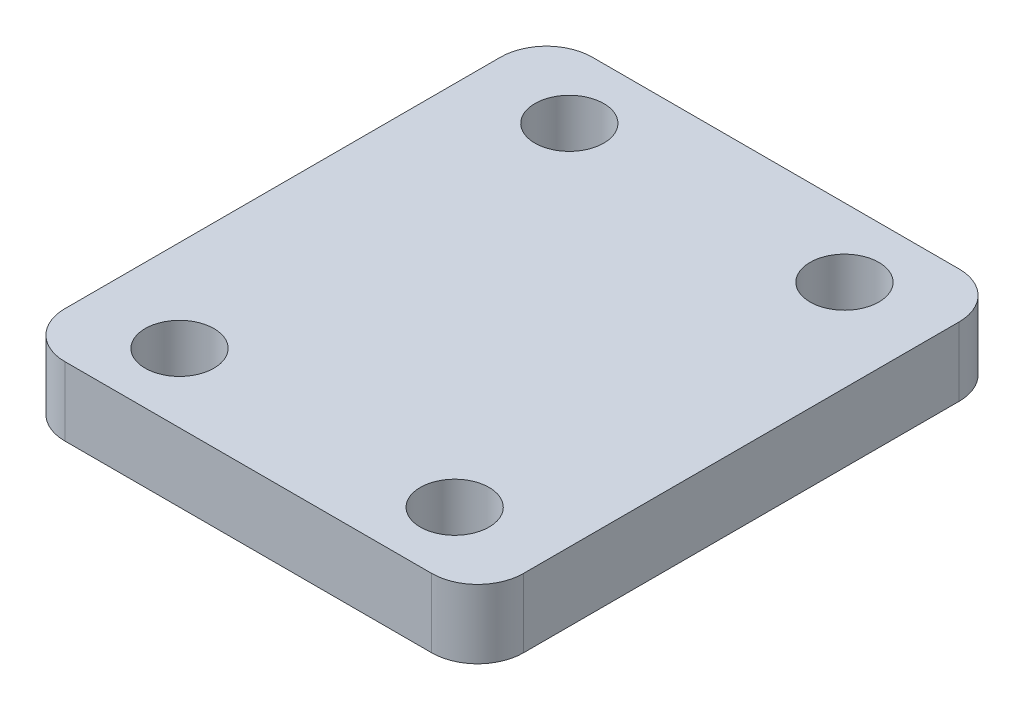
ISO-10303-21;
HEADER;
FILE_DESCRIPTION(('STEP AP214'),'2;1');
FILE_NAME('part.step','',(''),(''),'','','');
FILE_SCHEMA(('AUTOMOTIVE_DESIGN { 1 0 10303 214 1 1 1 1 }'));
ENDSEC;
DATA;
#1=APPLICATION_CONTEXT('core data for automotive mechanical design processes');
#2=APPLICATION_PROTOCOL_DEFINITION('international standard','automotive_design',2000,#1);
#3=PRODUCT_CONTEXT('',#1,'mechanical');
#4=PRODUCT('Part','Part','',(#3));
#5=PRODUCT_RELATED_PRODUCT_CATEGORY('part','',(#4));
#6=PRODUCT_DEFINITION_FORMATION('','',#4);
#7=PRODUCT_DEFINITION_CONTEXT('part definition',#1,'design');
#8=PRODUCT_DEFINITION('design','',#6,#7);
#9=PRODUCT_DEFINITION_SHAPE('','',#8);
#10=(LENGTH_UNIT() NAMED_UNIT(*) SI_UNIT(.MILLI.,.METRE.));
#11=(NAMED_UNIT(*) PLANE_ANGLE_UNIT() SI_UNIT($,.RADIAN.));
#12=(NAMED_UNIT(*) SI_UNIT($,.STERADIAN.) SOLID_ANGLE_UNIT());
#13=UNCERTAINTY_MEASURE_WITH_UNIT(LENGTH_MEASURE(1.E-05),#10,'distance_accuracy_value','');
#14=(GEOMETRIC_REPRESENTATION_CONTEXT(3) GLOBAL_UNCERTAINTY_ASSIGNED_CONTEXT((#13)) GLOBAL_UNIT_ASSIGNED_CONTEXT((#10,
#11,#12)) REPRESENTATION_CONTEXT('',''));
#15=CARTESIAN_POINT('',(0.,0.,0.));
#16=DIRECTION('',(0.,0.,1.));
#17=DIRECTION('',(1.,0.,0.));
#18=AXIS2_PLACEMENT_3D('',#15,#16,#17);
#19=CARTESIAN_POINT('',(0.,3.,0.));
#20=DIRECTION('',(0.,-1.,0.));
#21=DIRECTION('',(0.,0.,-1.));
#22=AXIS2_PLACEMENT_3D('',#19,#20,#21);
#23=PLANE('',#22);
#24=DIRECTION('',(1.,0.,0.));
#25=VECTOR('',#24,1.);
#26=CARTESIAN_POINT('',(-10.,3.,11.5));
#27=LINE('',#26,#25);
#28=CARTESIAN_POINT('',(-8.,3.,11.5));
#29=VERTEX_POINT('',#28);
#30=CARTESIAN_POINT('',(8.,3.,11.5));
#31=VERTEX_POINT('',#30);
#32=EDGE_CURVE('E153',#29,#31,#27,.T.);
#33=ORIENTED_EDGE('',*,*,#32,.T.);
#34=CARTESIAN_POINT('',(8.,3.,9.5));
#35=DIRECTION('',(0.,-1.,0.));
#36=DIRECTION('',(0.,0.,-1.));
#37=AXIS2_PLACEMENT_3D('',#34,#35,#36);
#38=CIRCLE('',#37,2.);
#39=CARTESIAN_POINT('',(10.,3.,9.5));
#40=VERTEX_POINT('',#39);
#41=EDGE_CURVE('E182',#31,#40,#38,.F.);
#42=ORIENTED_EDGE('',*,*,#41,.T.);
#43=DIRECTION('',(0.,0.,-1.));
#44=VECTOR('',#43,1.);
#45=CARTESIAN_POINT('',(10.,3.,11.5));
#46=LINE('',#45,#44);
#47=CARTESIAN_POINT('',(10.,3.,-9.5));
#48=VERTEX_POINT('',#47);
#49=EDGE_CURVE('E131',#40,#48,#46,.T.);
#50=ORIENTED_EDGE('',*,*,#49,.T.);
#51=CARTESIAN_POINT('',(8.,3.,-9.5));
#52=DIRECTION('',(0.,-1.,0.));
#53=DIRECTION('',(0.,0.,-1.));
#54=AXIS2_PLACEMENT_3D('',#51,#52,#53);
#55=CIRCLE('',#54,2.);
#56=CARTESIAN_POINT('',(8.,3.,-11.5));
#57=VERTEX_POINT('',#56);
#58=EDGE_CURVE('E176',#48,#57,#55,.F.);
#59=ORIENTED_EDGE('',*,*,#58,.T.);
#60=DIRECTION('',(-1.,0.,0.));
#61=VECTOR('',#60,1.);
#62=CARTESIAN_POINT('',(-10.,3.,-11.5));
#63=LINE('',#62,#61);
#64=CARTESIAN_POINT('',(-8.,3.,-11.5));
#65=VERTEX_POINT('',#64);
#66=EDGE_CURVE('E195',#57,#65,#63,.T.);
#67=ORIENTED_EDGE('',*,*,#66,.T.);
#68=CARTESIAN_POINT('',(-8.,3.,-9.5));
#69=DIRECTION('',(0.,-1.,0.));
#70=DIRECTION('',(0.,0.,-1.));
#71=AXIS2_PLACEMENT_3D('',#68,#69,#70);
#72=CIRCLE('',#71,2.);
#73=CARTESIAN_POINT('',(-10.,3.,-9.5));
#74=VERTEX_POINT('',#73);
#75=EDGE_CURVE('E65',#65,#74,#72,.F.);
#76=ORIENTED_EDGE('',*,*,#75,.T.);
#77=DIRECTION('',(0.,0.,1.));
#78=VECTOR('',#77,1.);
#79=CARTESIAN_POINT('',(-10.,3.,11.5));
#80=LINE('',#79,#78);
#81=CARTESIAN_POINT('',(-10.,3.,9.5));
#82=VERTEX_POINT('',#81);
#83=EDGE_CURVE('E202',#74,#82,#80,.T.);
#84=ORIENTED_EDGE('',*,*,#83,.T.);
#85=CARTESIAN_POINT('',(-8.,3.,9.5));
#86=DIRECTION('',(0.,-1.,0.));
#87=DIRECTION('',(0.,0.,-1.));
#88=AXIS2_PLACEMENT_3D('',#85,#86,#87);
#89=CIRCLE('',#88,2.);
#90=EDGE_CURVE('E179',#82,#29,#89,.F.);
#91=ORIENTED_EDGE('',*,*,#90,.T.);
#92=EDGE_LOOP('',(#33,#42,#50,#59,#67,#76,#84,#91));
#93=FACE_BOUND('',#92,.T.);
#94=CARTESIAN_POINT('',(-6.,3.,-8.5));
#95=DIRECTION('',(0.,1.,0.));
#96=DIRECTION('',(0.,0.,1.));
#97=AXIS2_PLACEMENT_3D('',#94,#95,#96);
#98=CIRCLE('',#97,1.5);
#99=CARTESIAN_POINT('',(-6.,3.,-7.));
#100=VERTEX_POINT('',#99);
#101=EDGE_CURVE('E142',#100,#100,#98,.T.);
#102=ORIENTED_EDGE('',*,*,#101,.F.);
#103=EDGE_LOOP('',(#102));
#104=FACE_BOUND('',#103,.T.);
#105=CARTESIAN_POINT('',(6.,3.,-8.5));
#106=DIRECTION('',(0.,1.,0.));
#107=DIRECTION('',(0.,0.,-1.));
#108=AXIS2_PLACEMENT_3D('',#105,#106,#107);
#109=CIRCLE('',#108,1.5);
#110=CARTESIAN_POINT('',(6.,3.,-10.));
#111=VERTEX_POINT('',#110);
#112=EDGE_CURVE('E221',#111,#111,#109,.T.);
#113=ORIENTED_EDGE('',*,*,#112,.F.);
#114=EDGE_LOOP('',(#113));
#115=FACE_BOUND('',#114,.T.);
#116=CARTESIAN_POINT('',(6.,3.,8.50000000000001));
#117=DIRECTION('',(0.,1.,0.));
#118=DIRECTION('',(0.,0.,1.));
#119=AXIS2_PLACEMENT_3D('',#116,#117,#118);
#120=CIRCLE('',#119,1.5);
#121=CARTESIAN_POINT('',(6.,3.,10.));
#122=VERTEX_POINT('',#121);
#123=EDGE_CURVE('E227',#122,#122,#120,.T.);
#124=ORIENTED_EDGE('',*,*,#123,.F.);
#125=EDGE_LOOP('',(#124));
#126=FACE_BOUND('',#125,.T.);
#127=CARTESIAN_POINT('',(-6.,3.,8.5));
#128=DIRECTION('',(0.,1.,0.));
#129=DIRECTION('',(0.,0.,-1.));
#130=AXIS2_PLACEMENT_3D('',#127,#128,#129);
#131=CIRCLE('',#130,1.5);
#132=CARTESIAN_POINT('',(-6.,3.,7.));
#133=VERTEX_POINT('',#132);
#134=EDGE_CURVE('E235',#133,#133,#131,.T.);
#135=ORIENTED_EDGE('',*,*,#134,.F.);
#136=EDGE_LOOP('',(#135));
#137=FACE_BOUND('',#136,.T.);
#138=ADVANCED_FACE('F42',(#93,#104,#115,#126,#137),#23,.F.);
#139=CARTESIAN_POINT('',(0.,0.,0.));
#140=DIRECTION('',(0.,-1.,0.));
#141=DIRECTION('',(0.,0.,-1.));
#142=AXIS2_PLACEMENT_3D('',#139,#140,#141);
#143=PLANE('',#142);
#144=CARTESIAN_POINT('',(6.,0.,8.50000000000001));
#145=DIRECTION('',(0.,1.,0.));
#146=DIRECTION('',(0.,0.,1.));
#147=AXIS2_PLACEMENT_3D('',#144,#145,#146);
#148=CIRCLE('',#147,1.5);
#149=CARTESIAN_POINT('',(6.,0.,10.));
#150=VERTEX_POINT('',#149);
#151=EDGE_CURVE('E231',#150,#150,#148,.T.);
#152=ORIENTED_EDGE('',*,*,#151,.T.);
#153=EDGE_LOOP('',(#152));
#154=FACE_BOUND('',#153,.T.);
#155=CARTESIAN_POINT('',(-6.,0.,-8.5));
#156=DIRECTION('',(0.,1.,0.));
#157=DIRECTION('',(0.,0.,1.));
#158=AXIS2_PLACEMENT_3D('',#155,#156,#157);
#159=CIRCLE('',#158,1.5);
#160=CARTESIAN_POINT('',(-6.,0.,-7.));
#161=VERTEX_POINT('',#160);
#162=EDGE_CURVE('E150',#161,#161,#159,.T.);
#163=ORIENTED_EDGE('',*,*,#162,.T.);
#164=EDGE_LOOP('',(#163));
#165=FACE_BOUND('',#164,.T.);
#166=DIRECTION('',(0.,0.,-1.));
#167=VECTOR('',#166,1.);
#168=CARTESIAN_POINT('',(10.,0.,11.5));
#169=LINE('',#168,#167);
#170=CARTESIAN_POINT('',(10.,0.,9.5));
#171=VERTEX_POINT('',#170);
#172=CARTESIAN_POINT('',(10.,0.,-9.5));
#173=VERTEX_POINT('',#172);
#174=EDGE_CURVE('E128',#171,#173,#169,.T.);
#175=ORIENTED_EDGE('',*,*,#174,.F.);
#176=CARTESIAN_POINT('',(8.,0.,9.5));
#177=DIRECTION('',(0.,-1.,0.));
#178=DIRECTION('',(0.,0.,-1.));
#179=AXIS2_PLACEMENT_3D('',#176,#177,#178);
#180=CIRCLE('',#179,2.);
#181=CARTESIAN_POINT('',(8.,0.,11.5));
#182=VERTEX_POINT('',#181);
#183=EDGE_CURVE('E110',#171,#182,#180,.T.);
#184=ORIENTED_EDGE('',*,*,#183,.T.);
#185=DIRECTION('',(1.,0.,0.));
#186=VECTOR('',#185,1.);
#187=CARTESIAN_POINT('',(-10.,0.,11.5));
#188=LINE('',#187,#186);
#189=CARTESIAN_POINT('',(-8.,0.,11.5));
#190=VERTEX_POINT('',#189);
#191=EDGE_CURVE('E158',#190,#182,#188,.T.);
#192=ORIENTED_EDGE('',*,*,#191,.F.);
#193=CARTESIAN_POINT('',(-8.,0.,9.5));
#194=DIRECTION('',(0.,-1.,0.));
#195=DIRECTION('',(0.,0.,-1.));
#196=AXIS2_PLACEMENT_3D('',#193,#194,#195);
#197=CIRCLE('',#196,2.);
#198=CARTESIAN_POINT('',(-10.,0.,9.5));
#199=VERTEX_POINT('',#198);
#200=EDGE_CURVE('E122',#190,#199,#197,.T.);
#201=ORIENTED_EDGE('',*,*,#200,.T.);
#202=DIRECTION('',(0.,0.,1.));
#203=VECTOR('',#202,1.);
#204=CARTESIAN_POINT('',(-10.,0.,11.5));
#205=LINE('',#204,#203);
#206=CARTESIAN_POINT('',(-10.,0.,-9.5));
#207=VERTEX_POINT('',#206);
#208=EDGE_CURVE('E147',#207,#199,#205,.T.);
#209=ORIENTED_EDGE('',*,*,#208,.F.);
#210=CARTESIAN_POINT('',(-8.,0.,-9.5));
#211=DIRECTION('',(0.,-1.,0.));
#212=DIRECTION('',(0.,0.,-1.));
#213=AXIS2_PLACEMENT_3D('',#210,#211,#212);
#214=CIRCLE('',#213,2.);
#215=CARTESIAN_POINT('',(-8.,0.,-11.5));
#216=VERTEX_POINT('',#215);
#217=EDGE_CURVE('E133',#207,#216,#214,.T.);
#218=ORIENTED_EDGE('',*,*,#217,.T.);
#219=DIRECTION('',(-1.,0.,0.));
#220=VECTOR('',#219,1.);
#221=CARTESIAN_POINT('',(-10.,0.,-11.5));
#222=LINE('',#221,#220);
#223=CARTESIAN_POINT('',(8.,0.,-11.5));
#224=VERTEX_POINT('',#223);
#225=EDGE_CURVE('E141',#224,#216,#222,.T.);
#226=ORIENTED_EDGE('',*,*,#225,.F.);
#227=CARTESIAN_POINT('',(8.,0.,-9.5));
#228=DIRECTION('',(0.,-1.,0.));
#229=DIRECTION('',(0.,0.,-1.));
#230=AXIS2_PLACEMENT_3D('',#227,#228,#229);
#231=CIRCLE('',#230,2.);
#232=EDGE_CURVE('E139',#224,#173,#231,.T.);
#233=ORIENTED_EDGE('',*,*,#232,.T.);
#234=EDGE_LOOP('',(#175,#184,#192,#201,#209,#218,#226,#233));
#235=FACE_BOUND('',#234,.T.);
#236=CARTESIAN_POINT('',(6.,0.,-8.5));
#237=DIRECTION('',(0.,1.,0.));
#238=DIRECTION('',(0.,0.,-1.));
#239=AXIS2_PLACEMENT_3D('',#236,#237,#238);
#240=CIRCLE('',#239,1.5);
#241=CARTESIAN_POINT('',(6.,0.,-10.));
#242=VERTEX_POINT('',#241);
#243=EDGE_CURVE('E223',#242,#242,#240,.T.);
#244=ORIENTED_EDGE('',*,*,#243,.T.);
#245=EDGE_LOOP('',(#244));
#246=FACE_BOUND('',#245,.T.);
#247=CARTESIAN_POINT('',(-6.,0.,8.5));
#248=DIRECTION('',(0.,1.,0.));
#249=DIRECTION('',(0.,0.,-1.));
#250=AXIS2_PLACEMENT_3D('',#247,#248,#249);
#251=CIRCLE('',#250,1.5);
#252=CARTESIAN_POINT('',(-6.,0.,7.));
#253=VERTEX_POINT('',#252);
#254=EDGE_CURVE('E239',#253,#253,#251,.T.);
#255=ORIENTED_EDGE('',*,*,#254,.T.);
#256=EDGE_LOOP('',(#255));
#257=FACE_BOUND('',#256,.T.);
#258=ADVANCED_FACE('F136',(#154,#165,#235,#246,#257),#143,.T.);
#259=CARTESIAN_POINT('',(10.,3.,11.5));
#260=DIRECTION('',(-1.,0.,0.));
#261=DIRECTION('',(0.,0.,1.));
#262=AXIS2_PLACEMENT_3D('',#259,#260,#261);
#263=PLANE('',#262);
#264=ORIENTED_EDGE('',*,*,#49,.F.);
#265=DIRECTION('',(0.,-1.,0.));
#266=VECTOR('',#265,1.);
#267=CARTESIAN_POINT('',(10.,3.,9.5));
#268=LINE('',#267,#266);
#269=EDGE_CURVE('E114',#40,#171,#268,.T.);
#270=ORIENTED_EDGE('',*,*,#269,.T.);
#271=ORIENTED_EDGE('',*,*,#174,.T.);
#272=DIRECTION('',(0.,-1.,0.));
#273=VECTOR('',#272,1.);
#274=CARTESIAN_POINT('',(10.,3.,-9.5));
#275=LINE('',#274,#273);
#276=EDGE_CURVE('E134',#173,#48,#275,.F.);
#277=ORIENTED_EDGE('',*,*,#276,.T.);
#278=EDGE_LOOP('',(#264,#270,#271,#277));
#279=FACE_BOUND('',#278,.T.);
#280=ADVANCED_FACE('F127',(#279),#263,.F.);
#281=CARTESIAN_POINT('',(-10.,3.,-11.5));
#282=DIRECTION('',(0.,0.,1.));
#283=DIRECTION('',(1.,0.,0.));
#284=AXIS2_PLACEMENT_3D('',#281,#282,#283);
#285=PLANE('',#284);
#286=ORIENTED_EDGE('',*,*,#66,.F.);
#287=DIRECTION('',(0.,-1.,0.));
#288=VECTOR('',#287,1.);
#289=CARTESIAN_POINT('',(8.,3.,-11.5));
#290=LINE('',#289,#288);
#291=EDGE_CURVE('E11',#57,#224,#290,.T.);
#292=ORIENTED_EDGE('',*,*,#291,.T.);
#293=ORIENTED_EDGE('',*,*,#225,.T.);
#294=DIRECTION('',(0.,-1.,0.));
#295=VECTOR('',#294,1.);
#296=CARTESIAN_POINT('',(-8.,3.,-11.5));
#297=LINE('',#296,#295);
#298=EDGE_CURVE('E51',#216,#65,#297,.F.);
#299=ORIENTED_EDGE('',*,*,#298,.T.);
#300=EDGE_LOOP('',(#286,#292,#293,#299));
#301=FACE_BOUND('',#300,.T.);
#302=ADVANCED_FACE('F194',(#301),#285,.F.);
#303=CARTESIAN_POINT('',(-10.,3.,11.5));
#304=DIRECTION('',(1.,0.,0.));
#305=DIRECTION('',(0.,0.,-1.));
#306=AXIS2_PLACEMENT_3D('',#303,#304,#305);
#307=PLANE('',#306);
#308=ORIENTED_EDGE('',*,*,#208,.T.);
#309=DIRECTION('',(0.,-1.,0.));
#310=VECTOR('',#309,1.);
#311=CARTESIAN_POINT('',(-10.,3.,9.5));
#312=LINE('',#311,#310);
#313=EDGE_CURVE('E58',#199,#82,#312,.F.);
#314=ORIENTED_EDGE('',*,*,#313,.T.);
#315=ORIENTED_EDGE('',*,*,#83,.F.);
#316=DIRECTION('',(0.,-1.,0.));
#317=VECTOR('',#316,1.);
#318=CARTESIAN_POINT('',(-10.,3.,-9.5));
#319=LINE('',#318,#317);
#320=EDGE_CURVE('E185',#74,#207,#319,.T.);
#321=ORIENTED_EDGE('',*,*,#320,.T.);
#322=EDGE_LOOP('',(#308,#314,#315,#321));
#323=FACE_BOUND('',#322,.T.);
#324=ADVANCED_FACE('F206',(#323),#307,.F.);
#325=CARTESIAN_POINT('',(-10.,3.,11.5));
#326=DIRECTION('',(0.,0.,-1.));
#327=DIRECTION('',(-1.,0.,0.));
#328=AXIS2_PLACEMENT_3D('',#325,#326,#327);
#329=PLANE('',#328);
#330=ORIENTED_EDGE('',*,*,#191,.T.);
#331=DIRECTION('',(0.,-1.,0.));
#332=VECTOR('',#331,1.);
#333=CARTESIAN_POINT('',(8.,3.,11.5));
#334=LINE('',#333,#332);
#335=EDGE_CURVE('E115',#182,#31,#334,.F.);
#336=ORIENTED_EDGE('',*,*,#335,.T.);
#337=ORIENTED_EDGE('',*,*,#32,.F.);
#338=DIRECTION('',(0.,-1.,0.));
#339=VECTOR('',#338,1.);
#340=CARTESIAN_POINT('',(-8.,3.,11.5));
#341=LINE('',#340,#339);
#342=EDGE_CURVE('E121',#29,#190,#341,.T.);
#343=ORIENTED_EDGE('',*,*,#342,.T.);
#344=EDGE_LOOP('',(#330,#336,#337,#343));
#345=FACE_BOUND('',#344,.T.);
#346=ADVANCED_FACE('F213',(#345),#329,.F.);
#347=CARTESIAN_POINT('',(-6.,3.,-8.5));
#348=DIRECTION('',(0.,-1.,0.));
#349=DIRECTION('',(0.,0.,-1.));
#350=AXIS2_PLACEMENT_3D('',#347,#348,#349);
#351=CYLINDRICAL_SURFACE('',#350,1.5);
#352=ORIENTED_EDGE('',*,*,#101,.T.);
#353=EDGE_LOOP('',(#352));
#354=FACE_BOUND('',#353,.T.);
#355=ORIENTED_EDGE('',*,*,#162,.F.);
#356=EDGE_LOOP('',(#355));
#357=FACE_BOUND('',#356,.T.);
#358=ADVANCED_FACE('F259',(#354,#357),#351,.F.);
#359=CARTESIAN_POINT('',(6.,3.,-8.5));
#360=DIRECTION('',(0.,-1.,0.));
#361=DIRECTION('',(0.,0.,-1.));
#362=AXIS2_PLACEMENT_3D('',#359,#360,#361);
#363=CYLINDRICAL_SURFACE('',#362,1.5);
#364=ORIENTED_EDGE('',*,*,#112,.T.);
#365=EDGE_LOOP('',(#364));
#366=FACE_BOUND('',#365,.T.);
#367=ORIENTED_EDGE('',*,*,#243,.F.);
#368=EDGE_LOOP('',(#367));
#369=FACE_BOUND('',#368,.T.);
#370=ADVANCED_FACE('F358',(#366,#369),#363,.F.);
#371=CARTESIAN_POINT('',(6.,3.,8.50000000000001));
#372=DIRECTION('',(0.,-1.,0.));
#373=DIRECTION('',(0.,0.,-1.));
#374=AXIS2_PLACEMENT_3D('',#371,#372,#373);
#375=CYLINDRICAL_SURFACE('',#374,1.5);
#376=ORIENTED_EDGE('',*,*,#123,.T.);
#377=EDGE_LOOP('',(#376));
#378=FACE_BOUND('',#377,.T.);
#379=ORIENTED_EDGE('',*,*,#151,.F.);
#380=EDGE_LOOP('',(#379));
#381=FACE_BOUND('',#380,.T.);
#382=ADVANCED_FACE('F367',(#378,#381),#375,.F.);
#383=CARTESIAN_POINT('',(-6.,3.,8.5));
#384=DIRECTION('',(0.,-1.,0.));
#385=DIRECTION('',(0.,0.,-1.));
#386=AXIS2_PLACEMENT_3D('',#383,#384,#385);
#387=CYLINDRICAL_SURFACE('',#386,1.5);
#388=ORIENTED_EDGE('',*,*,#134,.T.);
#389=EDGE_LOOP('',(#388));
#390=FACE_BOUND('',#389,.T.);
#391=ORIENTED_EDGE('',*,*,#254,.F.);
#392=EDGE_LOOP('',(#391));
#393=FACE_BOUND('',#392,.T.);
#394=ADVANCED_FACE('F247',(#390,#393),#387,.F.);
#395=CARTESIAN_POINT('',(8.,3.,9.5));
#396=DIRECTION('',(0.,-1.,0.));
#397=DIRECTION('',(0.,0.,-1.));
#398=AXIS2_PLACEMENT_3D('',#395,#396,#397);
#399=CYLINDRICAL_SURFACE('',#398,2.);
#400=ORIENTED_EDGE('',*,*,#41,.F.);
#401=ORIENTED_EDGE('',*,*,#335,.F.);
#402=ORIENTED_EDGE('',*,*,#183,.F.);
#403=ORIENTED_EDGE('',*,*,#269,.F.);
#404=EDGE_LOOP('',(#400,#401,#402,#403));
#405=FACE_BOUND('',#404,.T.);
#406=ADVANCED_FACE('F113',(#405),#399,.T.);
#407=CARTESIAN_POINT('',(-8.,3.,9.5));
#408=DIRECTION('',(0.,-1.,0.));
#409=DIRECTION('',(0.,0.,-1.));
#410=AXIS2_PLACEMENT_3D('',#407,#408,#409);
#411=CYLINDRICAL_SURFACE('',#410,2.);
#412=ORIENTED_EDGE('',*,*,#90,.F.);
#413=ORIENTED_EDGE('',*,*,#313,.F.);
#414=ORIENTED_EDGE('',*,*,#200,.F.);
#415=ORIENTED_EDGE('',*,*,#342,.F.);
#416=EDGE_LOOP('',(#412,#413,#414,#415));
#417=FACE_BOUND('',#416,.T.);
#418=ADVANCED_FACE('F210',(#417),#411,.T.);
#419=CARTESIAN_POINT('',(8.,3.,-9.5));
#420=DIRECTION('',(0.,-1.,0.));
#421=DIRECTION('',(0.,0.,-1.));
#422=AXIS2_PLACEMENT_3D('',#419,#420,#421);
#423=CYLINDRICAL_SURFACE('',#422,2.);
#424=ORIENTED_EDGE('',*,*,#58,.F.);
#425=ORIENTED_EDGE('',*,*,#276,.F.);
#426=ORIENTED_EDGE('',*,*,#232,.F.);
#427=ORIENTED_EDGE('',*,*,#291,.F.);
#428=EDGE_LOOP('',(#424,#425,#426,#427));
#429=FACE_BOUND('',#428,.T.);
#430=ADVANCED_FACE('F273',(#429),#423,.T.);
#431=CARTESIAN_POINT('',(-8.,3.,-9.5));
#432=DIRECTION('',(0.,-1.,0.));
#433=DIRECTION('',(0.,0.,-1.));
#434=AXIS2_PLACEMENT_3D('',#431,#432,#433);
#435=CYLINDRICAL_SURFACE('',#434,2.);
#436=ORIENTED_EDGE('',*,*,#75,.F.);
#437=ORIENTED_EDGE('',*,*,#298,.F.);
#438=ORIENTED_EDGE('',*,*,#217,.F.);
#439=ORIENTED_EDGE('',*,*,#320,.F.);
#440=EDGE_LOOP('',(#436,#437,#438,#439));
#441=FACE_BOUND('',#440,.T.);
#442=ADVANCED_FACE('F44',(#441),#435,.T.);
#443=CLOSED_SHELL('',(#138,#258,#280,#302,#324,#346,#358,#370,#382,#394,#406,#418,#430,#442));
#444=MANIFOLD_SOLID_BREP('B2',#443);
#445=ADVANCED_BREP_SHAPE_REPRESENTATION('',(#18,#444),#14);
#446=SHAPE_DEFINITION_REPRESENTATION(#9,#445);
ENDSEC;
END-ISO-10303-21;
